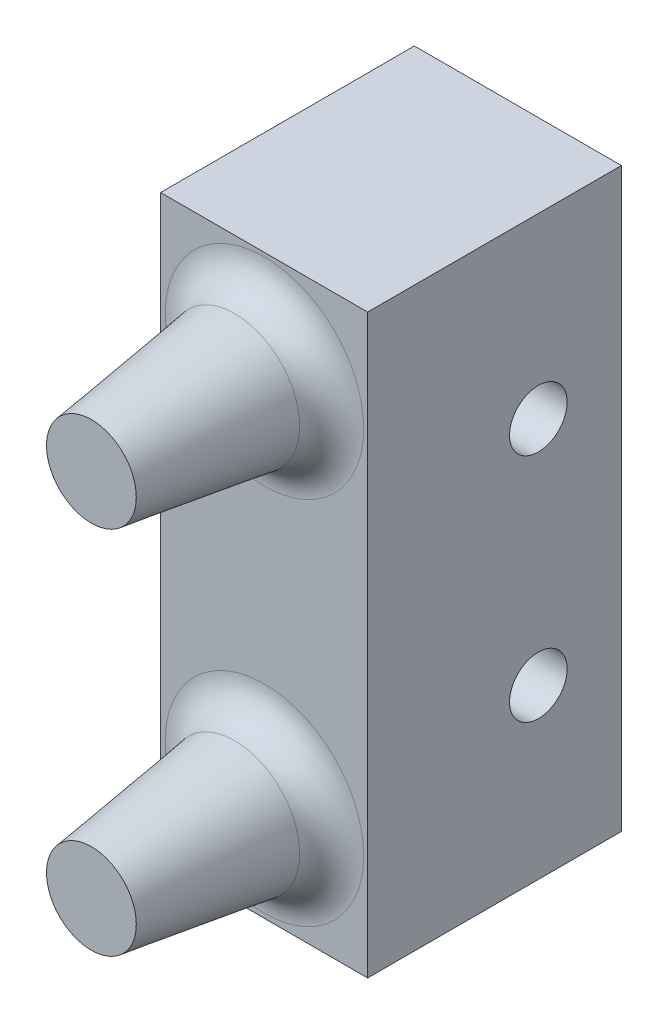
ISO-10303-21;
HEADER;
FILE_DESCRIPTION(('STEP AP214'),'2;1');
FILE_NAME('part.step','',(''),(''),'','','');
FILE_SCHEMA(('AUTOMOTIVE_DESIGN { 1 0 10303 214 1 1 1 1 }'));
ENDSEC;
DATA;
#1=APPLICATION_CONTEXT('core data for automotive mechanical design processes');
#2=APPLICATION_PROTOCOL_DEFINITION('international standard','automotive_design',2000,#1);
#3=PRODUCT_CONTEXT('',#1,'mechanical');
#4=PRODUCT('Part','Part','',(#3));
#5=PRODUCT_RELATED_PRODUCT_CATEGORY('part','',(#4));
#6=PRODUCT_DEFINITION_FORMATION('','',#4);
#7=PRODUCT_DEFINITION_CONTEXT('part definition',#1,'design');
#8=PRODUCT_DEFINITION('design','',#6,#7);
#9=PRODUCT_DEFINITION_SHAPE('','',#8);
#10=(LENGTH_UNIT() NAMED_UNIT(*) SI_UNIT(.MILLI.,.METRE.));
#11=(NAMED_UNIT(*) PLANE_ANGLE_UNIT() SI_UNIT($,.RADIAN.));
#12=(NAMED_UNIT(*) SI_UNIT($,.STERADIAN.) SOLID_ANGLE_UNIT());
#13=UNCERTAINTY_MEASURE_WITH_UNIT(LENGTH_MEASURE(1.E-05),#10,'distance_accuracy_value','');
#14=(GEOMETRIC_REPRESENTATION_CONTEXT(3) GLOBAL_UNCERTAINTY_ASSIGNED_CONTEXT((#13)) GLOBAL_UNIT_ASSIGNED_CONTEXT((#10,
#11,#12)) REPRESENTATION_CONTEXT('',''));
#15=CARTESIAN_POINT('',(0.,0.,0.));
#16=DIRECTION('',(0.,0.,1.));
#17=DIRECTION('',(1.,0.,0.));
#18=AXIS2_PLACEMENT_3D('',#15,#16,#17);
#19=CARTESIAN_POINT('',(715.655949843604,-640.080811228882,-22.0000000000006));
#20=DIRECTION('',(0.,1.00000000000004,0.));
#21=DIRECTION('',(0.,0.,1.));
#22=AXIS2_PLACEMENT_3D('',#19,#20,#21);
#23=PLANE('',#22);
#24=DIRECTION('',(-1.00000000000004,0.,0.));
#25=VECTOR('',#24,1.);
#26=CARTESIAN_POINT('',(715.655949843602,-640.080811228882,-5.55111512312578E-13));
#27=LINE('',#26,#25);
#28=CARTESIAN_POINT('',(715.655949843602,-640.080811228882,-5.55111512312578E-13));
#29=VERTEX_POINT('',#28);
#30=CARTESIAN_POINT('',(697.707943158923,-640.080811228882,-5.55111512312578E-13));
#31=VERTEX_POINT('',#30);
#32=EDGE_CURVE('E112',#29,#31,#27,.T.);
#33=ORIENTED_EDGE('',*,*,#32,.F.);
#34=DIRECTION('',(0.,0.,1.));
#35=VECTOR('',#34,1.);
#36=CARTESIAN_POINT('',(715.655949843604,-640.080811228882,-22.0000000000006));
#37=LINE('',#36,#35);
#38=CARTESIAN_POINT('',(715.655949843604,-640.080811228882,-22.0000000000006));
#39=VERTEX_POINT('',#38);
#40=EDGE_CURVE('E82',#39,#29,#37,.T.);
#41=ORIENTED_EDGE('',*,*,#40,.F.);
#42=DIRECTION('',(-1.00000000000004,0.,0.));
#43=VECTOR('',#42,1.);
#44=CARTESIAN_POINT('',(715.655949843604,-640.080811228882,-22.0000000000006));
#45=LINE('',#44,#43);
#46=CARTESIAN_POINT('',(697.707943158923,-640.080811228882,-22.0000000000006));
#47=VERTEX_POINT('',#46);
#48=EDGE_CURVE('E108',#39,#47,#45,.T.);
#49=ORIENTED_EDGE('',*,*,#48,.T.);
#50=DIRECTION('',(0.,0.,1.));
#51=VECTOR('',#50,1.);
#52=CARTESIAN_POINT('',(697.707943158923,-640.080811228882,-22.0000000000006));
#53=LINE('',#52,#51);
#54=EDGE_CURVE('E65',#47,#31,#53,.T.);
#55=ORIENTED_EDGE('',*,*,#54,.T.);
#56=EDGE_LOOP('',(#33,#41,#49,#55));
#57=FACE_BOUND('',#56,.T.);
#58=ADVANCED_FACE('F46',(#57),#23,.T.);
#59=CARTESIAN_POINT('',(715.655949843604,-690.080887605275,-22.0000000000006));
#60=DIRECTION('',(1.00000000000004,0.,0.));
#61=DIRECTION('',(0.,0.,-1.));
#62=AXIS2_PLACEMENT_3D('',#59,#60,#61);
#63=PLANE('',#62);
#64=CARTESIAN_POINT('',(715.655949843604,-675.510263035698,-14.8002095796339));
#65=DIRECTION('',(1.00000000000004,0.,0.));
#66=DIRECTION('',(0.,0.,-1.));
#67=AXIS2_PLACEMENT_3D('',#64,#65,#66);
#68=CIRCLE('',#67,2.50001263826395);
#69=CARTESIAN_POINT('',(715.655949843604,-675.510263035698,-17.3002222178979));
#70=VERTEX_POINT('',#69);
#71=EDGE_CURVE('E147',#70,#70,#68,.T.);
#72=ORIENTED_EDGE('',*,*,#71,.F.);
#73=EDGE_LOOP('',(#72));
#74=FACE_BOUND('',#73,.T.);
#75=CARTESIAN_POINT('',(715.655949843604,-655.486173040704,-14.8002095796339));
#76=DIRECTION('',(1.00000000000004,0.,0.));
#77=DIRECTION('',(0.,0.,-1.));
#78=AXIS2_PLACEMENT_3D('',#75,#76,#77);
#79=CIRCLE('',#78,2.50001263826394);
#80=CARTESIAN_POINT('',(715.655949843604,-655.486173040704,-17.3002222178978));
#81=VERTEX_POINT('',#80);
#82=EDGE_CURVE('E137',#81,#81,#79,.T.);
#83=ORIENTED_EDGE('',*,*,#82,.F.);
#84=EDGE_LOOP('',(#83));
#85=FACE_BOUND('',#84,.T.);
#86=DIRECTION('',(0.,1.00000000000004,0.));
#87=VECTOR('',#86,1.);
#88=CARTESIAN_POINT('',(715.655949843602,-690.080887605275,-5.55111512312578E-13));
#89=LINE('',#88,#87);
#90=CARTESIAN_POINT('',(715.655949843602,-690.080887605275,-5.55111512312578E-13));
#91=VERTEX_POINT('',#90);
#92=EDGE_CURVE('E96',#91,#29,#89,.T.);
#93=ORIENTED_EDGE('',*,*,#92,.F.);
#94=DIRECTION('',(0.,0.,1.));
#95=VECTOR('',#94,1.);
#96=CARTESIAN_POINT('',(715.655949843604,-690.080887605275,-22.0000000000006));
#97=LINE('',#96,#95);
#98=CARTESIAN_POINT('',(715.655949843604,-690.080887605275,-22.0000000000006));
#99=VERTEX_POINT('',#98);
#100=EDGE_CURVE('E91',#99,#91,#97,.T.);
#101=ORIENTED_EDGE('',*,*,#100,.F.);
#102=DIRECTION('',(0.,1.00000000000004,0.));
#103=VECTOR('',#102,1.);
#104=CARTESIAN_POINT('',(715.655949843604,-690.080887605275,-22.0000000000006));
#105=LINE('',#104,#103);
#106=EDGE_CURVE('E94',#99,#39,#105,.T.);
#107=ORIENTED_EDGE('',*,*,#106,.T.);
#108=ORIENTED_EDGE('',*,*,#40,.T.);
#109=EDGE_LOOP('',(#93,#101,#107,#108));
#110=FACE_BOUND('',#109,.T.);
#111=ADVANCED_FACE('F93',(#74,#85,#110),#63,.T.);
#112=CARTESIAN_POINT('',(697.707943158923,-690.080887605275,-22.0000000000006));
#113=DIRECTION('',(0.,-1.00000000000004,0.));
#114=DIRECTION('',(0.,0.,-1.));
#115=AXIS2_PLACEMENT_3D('',#112,#113,#114);
#116=PLANE('',#115);
#117=DIRECTION('',(1.00000000000004,0.,0.));
#118=VECTOR('',#117,1.);
#119=CARTESIAN_POINT('',(697.707943158923,-690.080887605275,-5.55111512312578E-13));
#120=LINE('',#119,#118);
#121=CARTESIAN_POINT('',(697.707943158923,-690.080887605275,-5.55111512312578E-13));
#122=VERTEX_POINT('',#121);
#123=EDGE_CURVE('E118',#122,#91,#120,.T.);
#124=ORIENTED_EDGE('',*,*,#123,.F.);
#125=DIRECTION('',(0.,0.,1.));
#126=VECTOR('',#125,1.);
#127=CARTESIAN_POINT('',(697.707943158923,-690.080887605275,-22.0000000000006));
#128=LINE('',#127,#126);
#129=CARTESIAN_POINT('',(697.707943158923,-690.080887605275,-22.0000000000006));
#130=VERTEX_POINT('',#129);
#131=EDGE_CURVE('E101',#130,#122,#128,.T.);
#132=ORIENTED_EDGE('',*,*,#131,.F.);
#133=DIRECTION('',(1.00000000000004,0.,0.));
#134=VECTOR('',#133,1.);
#135=CARTESIAN_POINT('',(697.707943158923,-690.080887605275,-22.0000000000006));
#136=LINE('',#135,#134);
#137=EDGE_CURVE('E106',#130,#99,#136,.T.);
#138=ORIENTED_EDGE('',*,*,#137,.T.);
#139=ORIENTED_EDGE('',*,*,#100,.T.);
#140=EDGE_LOOP('',(#124,#132,#138,#139));
#141=FACE_BOUND('',#140,.T.);
#142=ADVANCED_FACE('F110',(#141),#116,.T.);
#143=CARTESIAN_POINT('',(697.707943158923,-649.017765948874,-22.0000000000006));
#144=DIRECTION('',(-1.00000000000004,0.,0.));
#145=DIRECTION('',(0.,0.,1.));
#146=AXIS2_PLACEMENT_3D('',#143,#144,#145);
#147=PLANE('',#146);
#148=CARTESIAN_POINT('',(697.707943158923,-675.510263035698,-14.8002095796339));
#149=DIRECTION('',(-1.00000000000004,0.,0.));
#150=DIRECTION('',(0.,0.,1.));
#151=AXIS2_PLACEMENT_3D('',#148,#149,#150);
#152=CIRCLE('',#151,2.50001263826395);
#153=CARTESIAN_POINT('',(697.707943158923,-675.510263035698,-12.30019694137));
#154=VERTEX_POINT('',#153);
#155=EDGE_CURVE('E50',#154,#154,#152,.T.);
#156=ORIENTED_EDGE('',*,*,#155,.F.);
#157=EDGE_LOOP('',(#156));
#158=FACE_BOUND('',#157,.T.);
#159=CARTESIAN_POINT('',(697.707943158923,-655.486173040704,-14.8002095796339));
#160=DIRECTION('',(-1.00000000000004,0.,0.));
#161=DIRECTION('',(0.,0.,1.));
#162=AXIS2_PLACEMENT_3D('',#159,#160,#161);
#163=CIRCLE('',#162,2.50001263826394);
#164=CARTESIAN_POINT('',(697.707943158923,-655.486173040704,-12.30019694137));
#165=VERTEX_POINT('',#164);
#166=EDGE_CURVE('E134',#165,#165,#163,.T.);
#167=ORIENTED_EDGE('',*,*,#166,.F.);
#168=EDGE_LOOP('',(#167));
#169=FACE_BOUND('',#168,.T.);
#170=DIRECTION('',(0.,-1.00000000000004,0.));
#171=VECTOR('',#170,1.);
#172=CARTESIAN_POINT('',(697.707943158923,-649.017765948874,-5.55111512312578E-13));
#173=LINE('',#172,#171);
#174=EDGE_CURVE('E86',#31,#122,#173,.T.);
#175=ORIENTED_EDGE('',*,*,#174,.F.);
#176=ORIENTED_EDGE('',*,*,#54,.F.);
#177=DIRECTION('',(0.,-1.00000000000004,0.));
#178=VECTOR('',#177,1.);
#179=CARTESIAN_POINT('',(697.707943158923,-640.080811228882,-22.0000000000006));
#180=LINE('',#179,#178);
#181=EDGE_CURVE('E88',#47,#130,#180,.T.);
#182=ORIENTED_EDGE('',*,*,#181,.T.);
#183=ORIENTED_EDGE('',*,*,#131,.T.);
#184=EDGE_LOOP('',(#175,#176,#182,#183));
#185=FACE_BOUND('',#184,.T.);
#186=ADVANCED_FACE('F180',(#158,#169,#185),#147,.T.);
#187=CARTESIAN_POINT('',(0.,0.,-22.));
#188=DIRECTION('',(0.,0.,1.));
#189=DIRECTION('',(1.00000000000004,0.,0.));
#190=AXIS2_PLACEMENT_3D('',#187,#188,#189);
#191=PLANE('',#190);
#192=ORIENTED_EDGE('',*,*,#181,.F.);
#193=ORIENTED_EDGE('',*,*,#48,.F.);
#194=ORIENTED_EDGE('',*,*,#106,.F.);
#195=ORIENTED_EDGE('',*,*,#137,.F.);
#196=EDGE_LOOP('',(#192,#193,#194,#195));
#197=FACE_BOUND('',#196,.T.);
#198=ADVANCED_FACE('F105',(#197),#191,.F.);
#199=CARTESIAN_POINT('',(0.,0.,0.));
#200=DIRECTION('',(0.,0.,1.));
#201=DIRECTION('',(1.00000000000004,0.,0.));
#202=AXIS2_PLACEMENT_3D('',#199,#200,#201);
#203=PLANE('',#202);
#204=CARTESIAN_POINT('',(706.707943158923,-681.085054274191,-5.55111512312578E-13));
#205=DIRECTION('',(0.,0.,1.));
#206=DIRECTION('',(1.00000000000004,0.,0.));
#207=AXIS2_PLACEMENT_3D('',#204,#205,#206);
#208=CIRCLE('',#207,8.60786021344867);
#209=CARTESIAN_POINT('',(715.315803372372,-681.085054274191,-5.55111512312578E-13));
#210=VERTEX_POINT('',#209);
#211=EDGE_CURVE('E56',#210,#210,#208,.F.);
#212=ORIENTED_EDGE('',*,*,#211,.T.);
#213=EDGE_LOOP('',(#212));
#214=FACE_BOUND('',#213,.T.);
#215=CARTESIAN_POINT('',(706.707943158923,-649.017765948874,-5.55111512312578E-13));
#216=DIRECTION('',(0.,0.,1.));
#217=DIRECTION('',(1.00000000000004,0.,0.));
#218=AXIS2_PLACEMENT_3D('',#215,#216,#217);
#219=CIRCLE('',#218,8.60786021344867);
#220=CARTESIAN_POINT('',(715.315803372372,-649.017765948874,-5.55111512312578E-13));
#221=VERTEX_POINT('',#220);
#222=EDGE_CURVE('E130',#221,#221,#219,.F.);
#223=ORIENTED_EDGE('',*,*,#222,.T.);
#224=EDGE_LOOP('',(#223));
#225=FACE_BOUND('',#224,.T.);
#226=ORIENTED_EDGE('',*,*,#32,.T.);
#227=ORIENTED_EDGE('',*,*,#174,.T.);
#228=ORIENTED_EDGE('',*,*,#123,.T.);
#229=ORIENTED_EDGE('',*,*,#92,.T.);
#230=EDGE_LOOP('',(#226,#227,#228,#229));
#231=FACE_BOUND('',#230,.T.);
#232=ADVANCED_FACE('F156',(#214,#225,#231),#203,.T.);
#233=CARTESIAN_POINT('',(706.707943158923,-649.017765948874,-5.55111512312578E-13));
#234=DIRECTION('',(0.,0.,-1.));
#235=DIRECTION('',(1.00000000000004,0.,0.));
#236=AXIS2_PLACEMENT_3D('',#233,#234,#235);
#237=CONICAL_SURFACE('',#236,5.99999999999999,0.139626340159547);
#238=CARTESIAN_POINT('',(706.707943158923,-649.017765948874,2.58248069711925));
#239=DIRECTION('',(0.,0.,1.));
#240=DIRECTION('',(1.00000000000004,0.,0.));
#241=AXIS2_PLACEMENT_3D('',#238,#239,#240);
#242=CIRCLE('',#241,5.63705600722396);
#243=CARTESIAN_POINT('',(712.344999166147,-649.017765948874,2.58248069711925));
#244=VERTEX_POINT('',#243);
#245=EDGE_CURVE('E13',#244,#244,#242,.T.);
#246=ORIENTED_EDGE('',*,*,#245,.T.);
#247=EDGE_LOOP('',(#246));
#248=FACE_BOUND('',#247,.T.);
#249=CARTESIAN_POINT('',(706.707943158923,-649.017765948874,14.9999999999994));
#250=DIRECTION('',(0.,0.,1.));
#251=DIRECTION('',(1.00000000000004,0.,0.));
#252=AXIS2_PLACEMENT_3D('',#249,#250,#251);
#253=CIRCLE('',#252,3.89188747946411);
#254=CARTESIAN_POINT('',(710.599830638387,-649.017765948874,14.9999999999994));
#255=VERTEX_POINT('',#254);
#256=EDGE_CURVE('E119',#255,#255,#253,.T.);
#257=ORIENTED_EDGE('',*,*,#256,.F.);
#258=EDGE_LOOP('',(#257));
#259=FACE_BOUND('',#258,.T.);
#260=ADVANCED_FACE('F154',(#248,#259),#237,.T.);
#261=CARTESIAN_POINT('',(706.707943158923,-649.017765948874,14.9999999999994));
#262=DIRECTION('',(0.,0.,1.));
#263=DIRECTION('',(1.00000000000004,0.,0.));
#264=AXIS2_PLACEMENT_3D('',#261,#262,#263);
#265=PLANE('',#264);
#266=ORIENTED_EDGE('',*,*,#256,.T.);
#267=EDGE_LOOP('',(#266));
#268=FACE_BOUND('',#267,.T.);
#269=ADVANCED_FACE('F152',(#268),#265,.T.);
#270=CARTESIAN_POINT('',(706.707943158923,-681.085054274191,-5.55111512312578E-13));
#271=DIRECTION('',(0.,0.,-1.));
#272=DIRECTION('',(1.00000000000004,0.,0.));
#273=AXIS2_PLACEMENT_3D('',#270,#271,#272);
#274=CONICAL_SURFACE('',#273,5.99999999999999,0.139626340159547);
#275=CARTESIAN_POINT('',(706.707943158923,-681.085054274191,2.58248069711925));
#276=DIRECTION('',(0.,0.,1.));
#277=DIRECTION('',(1.00000000000004,0.,0.));
#278=AXIS2_PLACEMENT_3D('',#275,#276,#277);
#279=CIRCLE('',#278,5.63705600722396);
#280=CARTESIAN_POINT('',(712.344999166147,-681.085054274191,2.58248069711925));
#281=VERTEX_POINT('',#280);
#282=EDGE_CURVE('E125',#281,#281,#279,.T.);
#283=ORIENTED_EDGE('',*,*,#282,.T.);
#284=EDGE_LOOP('',(#283));
#285=FACE_BOUND('',#284,.T.);
#286=CARTESIAN_POINT('',(706.707943158923,-681.085054274191,14.9999999999994));
#287=DIRECTION('',(0.,0.,1.));
#288=DIRECTION('',(1.00000000000004,0.,0.));
#289=AXIS2_PLACEMENT_3D('',#286,#287,#288);
#290=CIRCLE('',#289,3.89188747946411);
#291=CARTESIAN_POINT('',(710.599830638387,-681.085054274191,14.9999999999994));
#292=VERTEX_POINT('',#291);
#293=EDGE_CURVE('E136',#292,#292,#290,.T.);
#294=ORIENTED_EDGE('',*,*,#293,.F.);
#295=EDGE_LOOP('',(#294));
#296=FACE_BOUND('',#295,.T.);
#297=ADVANCED_FACE('F163',(#285,#296),#274,.T.);
#298=CARTESIAN_POINT('',(706.707943158923,-681.085054274191,14.9999999999994));
#299=DIRECTION('',(0.,0.,1.));
#300=DIRECTION('',(1.00000000000004,0.,0.));
#301=AXIS2_PLACEMENT_3D('',#298,#299,#300);
#302=PLANE('',#301);
#303=ORIENTED_EDGE('',*,*,#293,.T.);
#304=EDGE_LOOP('',(#303));
#305=FACE_BOUND('',#304,.T.);
#306=ADVANCED_FACE('F185',(#305),#302,.T.);
#307=CARTESIAN_POINT('',(706.707943158923,-681.085054274191,2.99999999999945));
#308=DIRECTION('',(0.,0.,1.));
#309=DIRECTION('',(1.00000000000004,0.,0.));
#310=AXIS2_PLACEMENT_3D('',#307,#308,#309);
#311=TOROIDAL_SURFACE('',#310,8.60786021344867,3.);
#312=ORIENTED_EDGE('',*,*,#211,.F.);
#313=EDGE_LOOP('',(#312));
#314=FACE_BOUND('',#313,.T.);
#315=ORIENTED_EDGE('',*,*,#282,.F.);
#316=EDGE_LOOP('',(#315));
#317=FACE_BOUND('',#316,.T.);
#318=ADVANCED_FACE('F183',(#314,#317),#311,.F.);
#319=CARTESIAN_POINT('',(706.707943158923,-649.017765948874,2.99999999999945));
#320=DIRECTION('',(0.,0.,1.));
#321=DIRECTION('',(1.00000000000004,0.,0.));
#322=AXIS2_PLACEMENT_3D('',#319,#320,#321);
#323=TOROIDAL_SURFACE('',#322,8.60786021344867,3.);
#324=ORIENTED_EDGE('',*,*,#222,.F.);
#325=EDGE_LOOP('',(#324));
#326=FACE_BOUND('',#325,.T.);
#327=ORIENTED_EDGE('',*,*,#245,.F.);
#328=EDGE_LOOP('',(#327));
#329=FACE_BOUND('',#328,.T.);
#330=ADVANCED_FACE('F48',(#326,#329),#323,.F.);
#331=CARTESIAN_POINT('',(665.655949843602,-655.486173040704,-14.8002095796332));
#332=DIRECTION('',(1.00000000000004,0.,0.));
#333=DIRECTION('',(0.,0.,-1.));
#334=AXIS2_PLACEMENT_3D('',#331,#332,#333);
#335=CYLINDRICAL_SURFACE('',#334,2.50001263826394);
#336=ORIENTED_EDGE('',*,*,#166,.T.);
#337=EDGE_LOOP('',(#336));
#338=FACE_BOUND('',#337,.T.);
#339=ORIENTED_EDGE('',*,*,#82,.T.);
#340=EDGE_LOOP('',(#339));
#341=FACE_BOUND('',#340,.T.);
#342=ADVANCED_FACE('F191',(#338,#341),#335,.F.);
#343=CARTESIAN_POINT('',(665.655949843602,-675.510263035698,-14.8002095796332));
#344=DIRECTION('',(1.00000000000004,0.,0.));
#345=DIRECTION('',(0.,0.,-1.));
#346=AXIS2_PLACEMENT_3D('',#343,#344,#345);
#347=CYLINDRICAL_SURFACE('',#346,2.50001263826395);
#348=ORIENTED_EDGE('',*,*,#155,.T.);
#349=EDGE_LOOP('',(#348));
#350=FACE_BOUND('',#349,.T.);
#351=ORIENTED_EDGE('',*,*,#71,.T.);
#352=EDGE_LOOP('',(#351));
#353=FACE_BOUND('',#352,.T.);
#354=ADVANCED_FACE('F208',(#350,#353),#347,.F.);
#355=CLOSED_SHELL('',(#58,#111,#142,#186,#198,#232,#260,#269,#297,#306,#318,#330,#342,#354));
#356=MANIFOLD_SOLID_BREP('B2',#355);
#357=ADVANCED_BREP_SHAPE_REPRESENTATION('',(#18,#356),#14);
#358=SHAPE_DEFINITION_REPRESENTATION(#9,#357);
ENDSEC;
END-ISO-10303-21;
